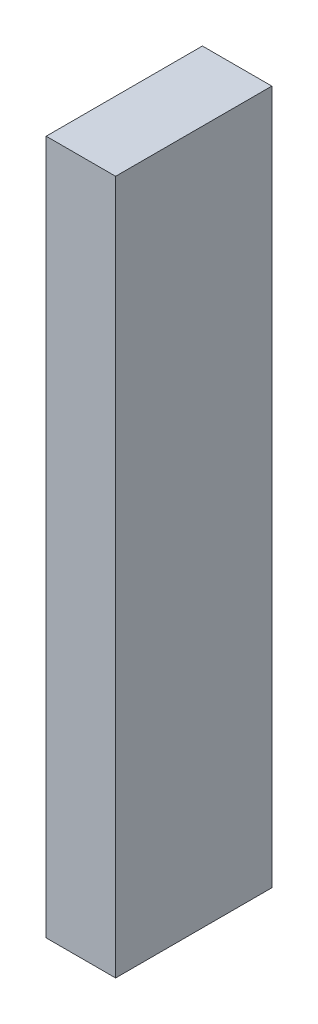
ISO-10303-21;
HEADER;
FILE_DESCRIPTION(('STEP AP214'),'2;1');
FILE_NAME('part.step','',(''),(''),'','','');
FILE_SCHEMA(('AUTOMOTIVE_DESIGN { 1 0 10303 214 1 1 1 1 }'));
ENDSEC;
DATA;
#1=APPLICATION_CONTEXT('core data for automotive mechanical design processes');
#2=APPLICATION_PROTOCOL_DEFINITION('international standard','automotive_design',2000,#1);
#3=PRODUCT_CONTEXT('',#1,'mechanical');
#4=PRODUCT('Part','Part','',(#3));
#5=PRODUCT_RELATED_PRODUCT_CATEGORY('part','',(#4));
#6=PRODUCT_DEFINITION_FORMATION('','',#4);
#7=PRODUCT_DEFINITION_CONTEXT('part definition',#1,'design');
#8=PRODUCT_DEFINITION('design','',#6,#7);
#9=PRODUCT_DEFINITION_SHAPE('','',#8);
#10=(LENGTH_UNIT() NAMED_UNIT(*) SI_UNIT(.MILLI.,.METRE.));
#11=(NAMED_UNIT(*) PLANE_ANGLE_UNIT() SI_UNIT($,.RADIAN.));
#12=(NAMED_UNIT(*) SI_UNIT($,.STERADIAN.) SOLID_ANGLE_UNIT());
#13=UNCERTAINTY_MEASURE_WITH_UNIT(LENGTH_MEASURE(1.E-05),#10,'distance_accuracy_value','');
#14=(GEOMETRIC_REPRESENTATION_CONTEXT(3) GLOBAL_UNCERTAINTY_ASSIGNED_CONTEXT((#13)) GLOBAL_UNIT_ASSIGNED_CONTEXT((#10,
#11,#12)) REPRESENTATION_CONTEXT('',''));
#15=CARTESIAN_POINT('',(0.,0.,0.));
#16=DIRECTION('',(0.,0.,1.));
#17=DIRECTION('',(1.,0.,0.));
#18=AXIS2_PLACEMENT_3D('',#15,#16,#17);
#19=CARTESIAN_POINT('',(0.,200.,-45.));
#20=DIRECTION('',(-1.,0.,0.));
#21=DIRECTION('',(0.,0.,1.));
#22=AXIS2_PLACEMENT_3D('',#19,#20,#21);
#23=PLANE('',#22);
#24=DIRECTION('',(0.,0.,-1.));
#25=VECTOR('',#24,1.);
#26=CARTESIAN_POINT('',(0.,0.,-45.));
#27=LINE('',#26,#25);
#28=CARTESIAN_POINT('',(0.,0.,0.));
#29=VERTEX_POINT('',#28);
#30=CARTESIAN_POINT('',(0.,0.,-45.));
#31=VERTEX_POINT('',#30);
#32=EDGE_CURVE('E98',#29,#31,#27,.T.);
#33=ORIENTED_EDGE('',*,*,#32,.T.);
#34=DIRECTION('',(0.,-1.,0.));
#35=VECTOR('',#34,1.);
#36=CARTESIAN_POINT('',(0.,200.,-45.));
#37=LINE('',#36,#35);
#38=CARTESIAN_POINT('',(0.,200.,-45.));
#39=VERTEX_POINT('',#38);
#40=EDGE_CURVE('E11',#39,#31,#37,.T.);
#41=ORIENTED_EDGE('',*,*,#40,.F.);
#42=DIRECTION('',(0.,0.,-1.));
#43=VECTOR('',#42,1.);
#44=CARTESIAN_POINT('',(0.,200.,-45.));
#45=LINE('',#44,#43);
#46=CARTESIAN_POINT('',(0.,200.,0.));
#47=VERTEX_POINT('',#46);
#48=EDGE_CURVE('E86',#47,#39,#45,.T.);
#49=ORIENTED_EDGE('',*,*,#48,.F.);
#50=DIRECTION('',(0.,-1.,0.));
#51=VECTOR('',#50,1.);
#52=CARTESIAN_POINT('',(0.,200.,0.));
#53=LINE('',#52,#51);
#54=EDGE_CURVE('E94',#47,#29,#53,.T.);
#55=ORIENTED_EDGE('',*,*,#54,.T.);
#56=EDGE_LOOP('',(#33,#41,#49,#55));
#57=FACE_BOUND('',#56,.T.);
#58=ADVANCED_FACE('F35',(#57),#23,.F.);
#59=CARTESIAN_POINT('',(-20.,200.,-45.));
#60=DIRECTION('',(0.,0.,1.));
#61=DIRECTION('',(1.,0.,0.));
#62=AXIS2_PLACEMENT_3D('',#59,#60,#61);
#63=PLANE('',#62);
#64=DIRECTION('',(-1.,0.,0.));
#65=VECTOR('',#64,1.);
#66=CARTESIAN_POINT('',(-20.,0.,-45.));
#67=LINE('',#66,#65);
#68=CARTESIAN_POINT('',(-20.,0.,-45.));
#69=VERTEX_POINT('',#68);
#70=EDGE_CURVE('E90',#31,#69,#67,.T.);
#71=ORIENTED_EDGE('',*,*,#70,.T.);
#72=DIRECTION('',(0.,-1.,0.));
#73=VECTOR('',#72,1.);
#74=CARTESIAN_POINT('',(-20.,200.,-45.));
#75=LINE('',#74,#73);
#76=CARTESIAN_POINT('',(-20.,200.,-45.));
#77=VERTEX_POINT('',#76);
#78=EDGE_CURVE('E43',#77,#69,#75,.T.);
#79=ORIENTED_EDGE('',*,*,#78,.F.);
#80=DIRECTION('',(-1.,0.,0.));
#81=VECTOR('',#80,1.);
#82=CARTESIAN_POINT('',(-20.,200.,-45.));
#83=LINE('',#82,#81);
#84=EDGE_CURVE('E81',#39,#77,#83,.T.);
#85=ORIENTED_EDGE('',*,*,#84,.F.);
#86=ORIENTED_EDGE('',*,*,#40,.T.);
#87=EDGE_LOOP('',(#71,#79,#85,#86));
#88=FACE_BOUND('',#87,.T.);
#89=ADVANCED_FACE('F89',(#88),#63,.F.);
#90=CARTESIAN_POINT('',(-20.,200.,0.));
#91=DIRECTION('',(1.,0.,0.));
#92=DIRECTION('',(0.,0.,-1.));
#93=AXIS2_PLACEMENT_3D('',#90,#91,#92);
#94=PLANE('',#93);
#95=DIRECTION('',(0.,0.,1.));
#96=VECTOR('',#95,1.);
#97=CARTESIAN_POINT('',(-20.,0.,0.));
#98=LINE('',#97,#96);
#99=CARTESIAN_POINT('',(-20.,0.,0.));
#100=VERTEX_POINT('',#99);
#101=EDGE_CURVE('E68',#69,#100,#98,.T.);
#102=ORIENTED_EDGE('',*,*,#101,.T.);
#103=DIRECTION('',(0.,-1.,0.));
#104=VECTOR('',#103,1.);
#105=CARTESIAN_POINT('',(-20.,200.,0.));
#106=LINE('',#105,#104);
#107=CARTESIAN_POINT('',(-20.,200.,0.));
#108=VERTEX_POINT('',#107);
#109=EDGE_CURVE('E91',#108,#100,#106,.T.);
#110=ORIENTED_EDGE('',*,*,#109,.F.);
#111=DIRECTION('',(0.,0.,1.));
#112=VECTOR('',#111,1.);
#113=CARTESIAN_POINT('',(-20.,200.,0.));
#114=LINE('',#113,#112);
#115=EDGE_CURVE('E84',#77,#108,#114,.T.);
#116=ORIENTED_EDGE('',*,*,#115,.F.);
#117=ORIENTED_EDGE('',*,*,#78,.T.);
#118=EDGE_LOOP('',(#102,#110,#116,#117));
#119=FACE_BOUND('',#118,.T.);
#120=ADVANCED_FACE('F92',(#119),#94,.F.);
#121=CARTESIAN_POINT('',(0.,200.,0.));
#122=DIRECTION('',(0.,0.,-1.));
#123=DIRECTION('',(-1.,0.,0.));
#124=AXIS2_PLACEMENT_3D('',#121,#122,#123);
#125=PLANE('',#124);
#126=DIRECTION('',(1.,0.,0.));
#127=VECTOR('',#126,1.);
#128=CARTESIAN_POINT('',(0.,0.,0.));
#129=LINE('',#128,#127);
#130=EDGE_CURVE('E74',#100,#29,#129,.T.);
#131=ORIENTED_EDGE('',*,*,#130,.T.);
#132=ORIENTED_EDGE('',*,*,#54,.F.);
#133=DIRECTION('',(1.,0.,0.));
#134=VECTOR('',#133,1.);
#135=CARTESIAN_POINT('',(0.,200.,0.));
#136=LINE('',#135,#134);
#137=EDGE_CURVE('E51',#108,#47,#136,.T.);
#138=ORIENTED_EDGE('',*,*,#137,.F.);
#139=ORIENTED_EDGE('',*,*,#109,.T.);
#140=EDGE_LOOP('',(#131,#132,#138,#139));
#141=FACE_BOUND('',#140,.T.);
#142=ADVANCED_FACE('F105',(#141),#125,.F.);
#143=CARTESIAN_POINT('',(0.,200.,0.));
#144=DIRECTION('',(0.,-1.,0.));
#145=DIRECTION('',(0.,0.,-1.));
#146=AXIS2_PLACEMENT_3D('',#143,#144,#145);
#147=PLANE('',#146);
#148=ORIENTED_EDGE('',*,*,#48,.T.);
#149=ORIENTED_EDGE('',*,*,#84,.T.);
#150=ORIENTED_EDGE('',*,*,#115,.T.);
#151=ORIENTED_EDGE('',*,*,#137,.T.);
#152=EDGE_LOOP('',(#148,#149,#150,#151));
#153=FACE_BOUND('',#152,.T.);
#154=ADVANCED_FACE('F82',(#153),#147,.F.);
#155=CARTESIAN_POINT('',(0.,0.,0.));
#156=DIRECTION('',(0.,-1.,0.));
#157=DIRECTION('',(0.,0.,-1.));
#158=AXIS2_PLACEMENT_3D('',#155,#156,#157);
#159=PLANE('',#158);
#160=ORIENTED_EDGE('',*,*,#32,.F.);
#161=ORIENTED_EDGE('',*,*,#130,.F.);
#162=ORIENTED_EDGE('',*,*,#101,.F.);
#163=ORIENTED_EDGE('',*,*,#70,.F.);
#164=EDGE_LOOP('',(#160,#161,#162,#163));
#165=FACE_BOUND('',#164,.T.);
#166=ADVANCED_FACE('F108',(#165),#159,.T.);
#167=CLOSED_SHELL('',(#58,#89,#120,#142,#154,#166));
#168=MANIFOLD_SOLID_BREP('B2',#167);
#169=ADVANCED_BREP_SHAPE_REPRESENTATION('',(#18,#168),#14);
#170=SHAPE_DEFINITION_REPRESENTATION(#9,#169);
ENDSEC;
END-ISO-10303-21;
